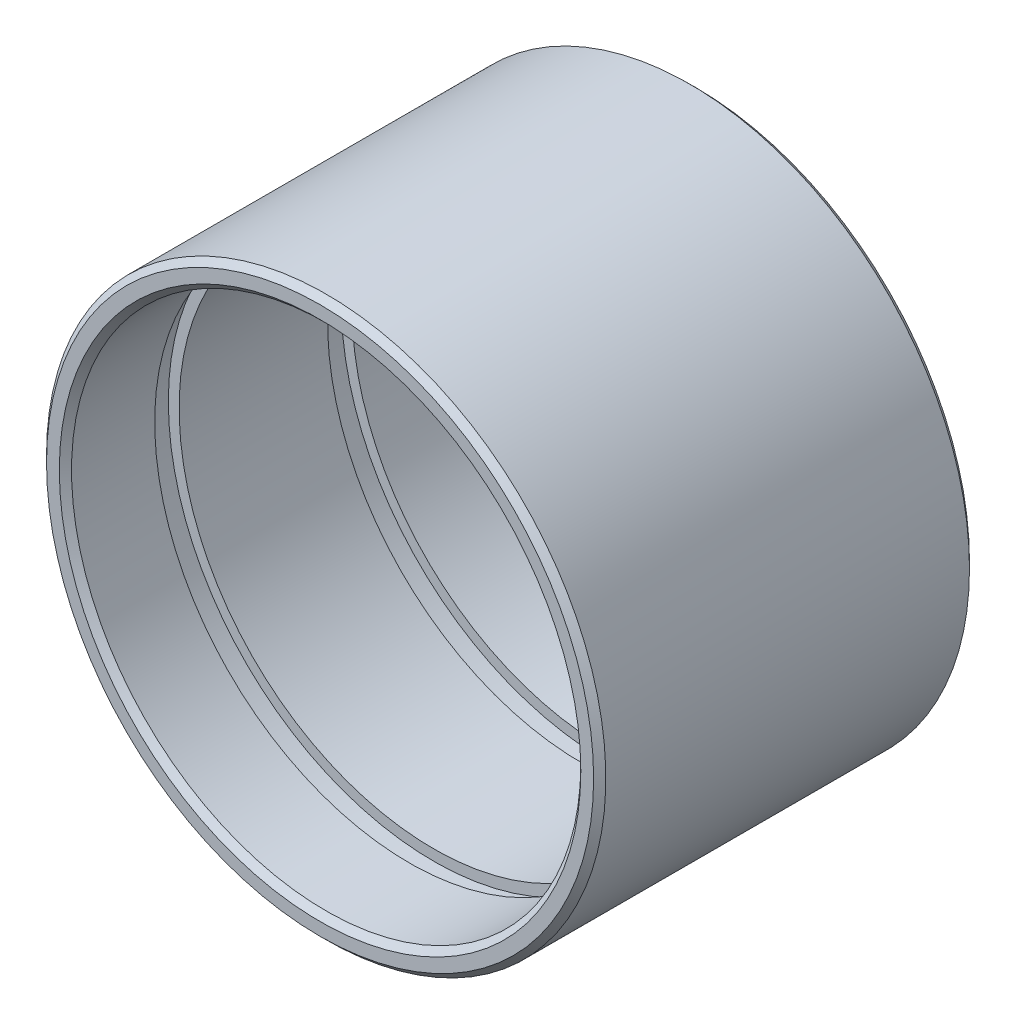
ISO-10303-21;
HEADER;
FILE_DESCRIPTION(('STEP AP214'),'2;1');
FILE_NAME('part.step','',(''),(''),'','','');
FILE_SCHEMA(('AUTOMOTIVE_DESIGN { 1 0 10303 214 1 1 1 1 }'));
ENDSEC;
DATA;
#1=APPLICATION_CONTEXT('core data for automotive mechanical design processes');
#2=APPLICATION_PROTOCOL_DEFINITION('international standard','automotive_design',2000,#1);
#3=PRODUCT_CONTEXT('',#1,'mechanical');
#4=PRODUCT('Part','Part','',(#3));
#5=PRODUCT_RELATED_PRODUCT_CATEGORY('part','',(#4));
#6=PRODUCT_DEFINITION_FORMATION('','',#4);
#7=PRODUCT_DEFINITION_CONTEXT('part definition',#1,'design');
#8=PRODUCT_DEFINITION('design','',#6,#7);
#9=PRODUCT_DEFINITION_SHAPE('','',#8);
#10=(LENGTH_UNIT() NAMED_UNIT(*) SI_UNIT(.MILLI.,.METRE.));
#11=(NAMED_UNIT(*) PLANE_ANGLE_UNIT() SI_UNIT($,.RADIAN.));
#12=(NAMED_UNIT(*) SI_UNIT($,.STERADIAN.) SOLID_ANGLE_UNIT());
#13=UNCERTAINTY_MEASURE_WITH_UNIT(LENGTH_MEASURE(1.E-05),#10,'distance_accuracy_value','');
#14=(GEOMETRIC_REPRESENTATION_CONTEXT(3) GLOBAL_UNCERTAINTY_ASSIGNED_CONTEXT((#13)) GLOBAL_UNIT_ASSIGNED_CONTEXT((#10,
#11,#12)) REPRESENTATION_CONTEXT('',''));
#15=CARTESIAN_POINT('',(0.,0.,0.));
#16=DIRECTION('',(0.,0.,1.));
#17=DIRECTION('',(1.,0.,0.));
#18=AXIS2_PLACEMENT_3D('',#15,#16,#17);
#19=CARTESIAN_POINT('',(0.,0.,23.4696));
#20=DIRECTION('',(0.,0.,-1.));
#21=DIRECTION('',(-1.,0.,0.));
#22=AXIS2_PLACEMENT_3D('',#19,#20,#21);
#23=CYLINDRICAL_SURFACE('',#22,15.9004);
#24=CARTESIAN_POINT('',(0.,0.,7.0993));
#25=DIRECTION('',(0.,0.,1.));
#26=DIRECTION('',(1.,0.,0.));
#27=AXIS2_PLACEMENT_3D('',#24,#25,#26);
#28=CIRCLE('',#27,15.9004);
#29=CARTESIAN_POINT('',(15.9004,0.,7.0993));
#30=VERTEX_POINT('',#29);
#31=EDGE_CURVE('E73',#30,#30,#28,.T.);
#32=ORIENTED_EDGE('',*,*,#31,.F.);
#33=EDGE_LOOP('',(#32));
#34=FACE_BOUND('',#33,.T.);
#35=CARTESIAN_POINT('',(0.,0.,16.3703));
#36=DIRECTION('',(0.,0.,1.));
#37=DIRECTION('',(1.,0.,0.));
#38=AXIS2_PLACEMENT_3D('',#35,#36,#37);
#39=CIRCLE('',#38,15.9004);
#40=CARTESIAN_POINT('',(15.9004,0.,16.3703));
#41=VERTEX_POINT('',#40);
#42=EDGE_CURVE('E67',#41,#41,#39,.T.);
#43=ORIENTED_EDGE('',*,*,#42,.T.);
#44=EDGE_LOOP('',(#43));
#45=FACE_BOUND('',#44,.T.);
#46=ADVANCED_FACE('F30',(#34,#45),#23,.F.);
#47=CARTESIAN_POINT('',(0.,0.,0.381000000000006));
#48=DIRECTION('',(0.,0.,1.));
#49=DIRECTION('',(1.,0.,0.));
#50=AXIS2_PLACEMENT_3D('',#47,#48,#49);
#51=CIRCLE('',#50,15.9004);
#52=CARTESIAN_POINT('',(-15.9004,0.,0.381000000000006));
#53=VERTEX_POINT('',#52);
#54=EDGE_CURVE('E10',#53,#53,#51,.F.);
#55=ORIENTED_EDGE('',*,*,#54,.T.);
#56=EDGE_LOOP('',(#55));
#57=FACE_BOUND('',#56,.T.);
#58=CARTESIAN_POINT('',(0.,0.,5.5753));
#59=DIRECTION('',(0.,0.,1.));
#60=DIRECTION('',(1.,0.,0.));
#61=AXIS2_PLACEMENT_3D('',#58,#59,#60);
#62=CIRCLE('',#61,15.9004);
#63=CARTESIAN_POINT('',(15.9004,0.,5.5753));
#64=VERTEX_POINT('',#63);
#65=EDGE_CURVE('E62',#64,#64,#62,.T.);
#66=ORIENTED_EDGE('',*,*,#65,.T.);
#67=EDGE_LOOP('',(#66));
#68=FACE_BOUND('',#67,.T.);
#69=ADVANCED_FACE('F105',(#57,#68),#23,.F.);
#70=CARTESIAN_POINT('',(0.,0.,23.4696));
#71=DIRECTION('',(0.,0.,1.));
#72=DIRECTION('',(1.,0.,0.));
#73=AXIS2_PLACEMENT_3D('',#70,#71,#72);
#74=PLANE('',#73);
#75=CARTESIAN_POINT('',(0.,0.,23.4696));
#76=DIRECTION('',(0.,0.,1.));
#77=DIRECTION('',(1.,0.,0.));
#78=AXIS2_PLACEMENT_3D('',#75,#76,#77);
#79=CIRCLE('',#78,16.2814);
#80=CARTESIAN_POINT('',(16.2814,0.,23.4696));
#81=VERTEX_POINT('',#80);
#82=EDGE_CURVE('E53',#81,#81,#79,.F.);
#83=ORIENTED_EDGE('',*,*,#82,.T.);
#84=EDGE_LOOP('',(#83));
#85=FACE_BOUND('',#84,.T.);
#86=CARTESIAN_POINT('',(0.,0.,23.4696));
#87=DIRECTION('',(0.,0.,1.));
#88=DIRECTION('',(1.,0.,0.));
#89=AXIS2_PLACEMENT_3D('',#86,#87,#88);
#90=CIRCLE('',#89,17.0815);
#91=CARTESIAN_POINT('',(-17.0815,0.,23.4696));
#92=VERTEX_POINT('',#91);
#93=EDGE_CURVE('E56',#92,#92,#90,.T.);
#94=ORIENTED_EDGE('',*,*,#93,.T.);
#95=EDGE_LOOP('',(#94));
#96=FACE_BOUND('',#95,.T.);
#97=ADVANCED_FACE('F112',(#85,#96),#74,.T.);
#98=CARTESIAN_POINT('',(0.,0.,0.));
#99=DIRECTION('',(0.,0.,1.));
#100=DIRECTION('',(1.,0.,0.));
#101=AXIS2_PLACEMENT_3D('',#98,#99,#100);
#102=PLANE('',#101);
#103=CARTESIAN_POINT('',(0.,0.,0.));
#104=DIRECTION('',(0.,0.,1.));
#105=DIRECTION('',(1.,0.,0.));
#106=AXIS2_PLACEMENT_3D('',#103,#104,#105);
#107=CIRCLE('',#106,16.2814);
#108=CARTESIAN_POINT('',(-16.2814,0.,0.));
#109=VERTEX_POINT('',#108);
#110=EDGE_CURVE('E37',#109,#109,#107,.T.);
#111=ORIENTED_EDGE('',*,*,#110,.T.);
#112=EDGE_LOOP('',(#111));
#113=FACE_BOUND('',#112,.T.);
#114=CARTESIAN_POINT('',(0.,0.,0.));
#115=DIRECTION('',(0.,0.,1.));
#116=DIRECTION('',(1.,0.,0.));
#117=AXIS2_PLACEMENT_3D('',#114,#115,#116);
#118=CIRCLE('',#117,17.0815);
#119=CARTESIAN_POINT('',(17.0815,0.,0.));
#120=VERTEX_POINT('',#119);
#121=EDGE_CURVE('E41',#120,#120,#118,.F.);
#122=ORIENTED_EDGE('',*,*,#121,.T.);
#123=EDGE_LOOP('',(#122));
#124=FACE_BOUND('',#123,.T.);
#125=ADVANCED_FACE('F127',(#113,#124),#102,.F.);
#126=CARTESIAN_POINT('',(0.,0.,23.4696));
#127=DIRECTION('',(0.,0.,-1.));
#128=DIRECTION('',(-1.,0.,0.));
#129=AXIS2_PLACEMENT_3D('',#126,#127,#128);
#130=CYLINDRICAL_SURFACE('',#129,17.4625);
#131=CARTESIAN_POINT('',(0.,0.,23.0886));
#132=DIRECTION('',(0.,0.,1.));
#133=DIRECTION('',(1.,0.,0.));
#134=AXIS2_PLACEMENT_3D('',#131,#132,#133);
#135=CIRCLE('',#134,17.4625);
#136=CARTESIAN_POINT('',(-17.4625,0.,23.0886));
#137=VERTEX_POINT('',#136);
#138=EDGE_CURVE('E45',#137,#137,#135,.F.);
#139=CARTESIAN_POINT('',(0.,0.,0.381000000000006));
#140=DIRECTION('',(0.,0.,1.));
#141=DIRECTION('',(1.,0.,0.));
#142=AXIS2_PLACEMENT_3D('',#139,#140,#141);
#143=CIRCLE('',#142,17.4625);
#144=CARTESIAN_POINT('',(-17.4625,0.,0.381000000000006));
#145=VERTEX_POINT('',#144);
#146=EDGE_CURVE('E50',#145,#145,#143,.T.);
#147=CARTESIAN_POINT('',(-17.4625,0.,23.0886));
#148=CARTESIAN_POINT('',(-17.4625,0.,22.8520625));
#149=CARTESIAN_POINT('',(-17.4625,0.,22.615525));
#150=CARTESIAN_POINT('',(-17.4625,0.,22.14245));
#151=CARTESIAN_POINT('',(-17.4625,0.,21.9059125));
#152=CARTESIAN_POINT('',(-17.4625,0.,21.4328375));
#153=CARTESIAN_POINT('',(-17.4625,0.,21.1963));
#154=CARTESIAN_POINT('',(-17.4625,0.,20.723225));
#155=CARTESIAN_POINT('',(-17.4625,0.,20.4866875));
#156=CARTESIAN_POINT('',(-17.4625,0.,20.0136125));
#157=CARTESIAN_POINT('',(-17.4625,0.,19.777075));
#158=CARTESIAN_POINT('',(-17.4625,0.,19.304));
#159=CARTESIAN_POINT('',(-17.4625,0.,19.0674625));
#160=CARTESIAN_POINT('',(-17.4625,0.,18.5943875));
#161=CARTESIAN_POINT('',(-17.4625,0.,18.35785));
#162=CARTESIAN_POINT('',(-17.4625,0.,17.884775));
#163=CARTESIAN_POINT('',(-17.4625,0.,17.6482375));
#164=CARTESIAN_POINT('',(-17.4625,0.,17.1751625));
#165=CARTESIAN_POINT('',(-17.4625,0.,16.938625));
#166=CARTESIAN_POINT('',(-17.4625,0.,16.46555));
#167=CARTESIAN_POINT('',(-17.4625,0.,16.2290125));
#168=CARTESIAN_POINT('',(-17.4625,0.,15.7559375));
#169=CARTESIAN_POINT('',(-17.4625,0.,15.5194));
#170=CARTESIAN_POINT('',(-17.4625,0.,15.046325));
#171=CARTESIAN_POINT('',(-17.4625,0.,14.8097875));
#172=CARTESIAN_POINT('',(-17.4625,0.,14.3367125));
#173=CARTESIAN_POINT('',(-17.4625,0.,14.100175));
#174=CARTESIAN_POINT('',(-17.4625,0.,13.6271));
#175=CARTESIAN_POINT('',(-17.4625,0.,13.3905625));
#176=CARTESIAN_POINT('',(-17.4625,0.,12.9174875));
#177=CARTESIAN_POINT('',(-17.4625,0.,12.68095));
#178=CARTESIAN_POINT('',(-17.4625,0.,12.207875));
#179=CARTESIAN_POINT('',(-17.4625,0.,11.9713375));
#180=CARTESIAN_POINT('',(-17.4625,0.,11.4982625));
#181=CARTESIAN_POINT('',(-17.4625,0.,11.261725));
#182=CARTESIAN_POINT('',(-17.4625,0.,10.78865));
#183=CARTESIAN_POINT('',(-17.4625,0.,10.5521125));
#184=CARTESIAN_POINT('',(-17.4625,0.,10.0790375));
#185=CARTESIAN_POINT('',(-17.4625,0.,9.8425));
#186=CARTESIAN_POINT('',(-17.4625,0.,9.369425));
#187=CARTESIAN_POINT('',(-17.4625,0.,9.1328875));
#188=CARTESIAN_POINT('',(-17.4625,0.,8.6598125));
#189=CARTESIAN_POINT('',(-17.4625,0.,8.423275));
#190=CARTESIAN_POINT('',(-17.4625,0.,7.9502));
#191=CARTESIAN_POINT('',(-17.4625,0.,7.7136625));
#192=CARTESIAN_POINT('',(-17.4625,0.,7.2405875));
#193=CARTESIAN_POINT('',(-17.4625,0.,7.00405));
#194=CARTESIAN_POINT('',(-17.4625,0.,6.530975));
#195=CARTESIAN_POINT('',(-17.4625,0.,6.2944375));
#196=CARTESIAN_POINT('',(-17.4625,0.,5.8213625));
#197=CARTESIAN_POINT('',(-17.4625,0.,5.584825));
#198=CARTESIAN_POINT('',(-17.4625,0.,5.11175));
#199=CARTESIAN_POINT('',(-17.4625,0.,4.8752125));
#200=CARTESIAN_POINT('',(-17.4625,0.,4.4021375));
#201=CARTESIAN_POINT('',(-17.4625,0.,4.1656));
#202=CARTESIAN_POINT('',(-17.4625,0.,3.692525));
#203=CARTESIAN_POINT('',(-17.4625,0.,3.45598750000001));
#204=CARTESIAN_POINT('',(-17.4625,0.,2.9829125));
#205=CARTESIAN_POINT('',(-17.4625,0.,2.746375));
#206=CARTESIAN_POINT('',(-17.4625,0.,2.2733));
#207=CARTESIAN_POINT('',(-17.4625,0.,2.0367625));
#208=CARTESIAN_POINT('',(-17.4625,0.,1.5636875));
#209=CARTESIAN_POINT('',(-17.4625,0.,1.32715));
#210=CARTESIAN_POINT('',(-17.4625,0.,0.854075000000005));
#211=CARTESIAN_POINT('',(-17.4625,0.,0.617537500000005));
#212=CARTESIAN_POINT('',(-17.4625,0.,0.381000000000006));
#213=B_SPLINE_CURVE_WITH_KNOTS('',3,(#147,#148,#149,#150,#151,#152,#153,#154,#155,#156,#157,
#158,#159,#160,#161,#162,#163,#164,#165,#166,#167,#168,#169,#170,#171,#172,#173,#174,#175,#176,
#177,#178,#179,#180,#181,#182,#183,#184,#185,#186,#187,#188,#189,#190,#191,#192,#193,#194,#195,
#196,#197,#198,#199,#200,#201,#202,#203,#204,#205,#206,#207,#208,#209,#210,#211,#212),
.UNSPECIFIED.,.F.,.F.,(4,2,2,2,2,2,2,2,2,2,2,2,2,2,2,2,2,2,2,2,2,2,2,2,2,2,2,2,2,2,2,2,4),(0.,
0.709612500000002,1.419225,2.1288375,2.83845,3.5480625,4.257675,4.9672875,5.6769,6.3865125,
7.096125,7.8057375,8.51535,9.2249625,9.934575,10.6441875,11.3538,12.0634125,12.773025,
13.4826375,14.19225,14.9018625,15.611475,16.3210875,17.0307,17.7403125,18.449925,19.1595375,
19.86915,20.5787625,21.288375,21.9979875,22.7076),.UNSPECIFIED.);
#214=EDGE_CURVE('BSEAM119',#137,#145,#213,.T.);
#215=ORIENTED_EDGE('',*,*,#138,.T.);
#216=ORIENTED_EDGE('',*,*,#146,.T.);
#217=ORIENTED_EDGE('',*,*,#214,.T.);
#218=ORIENTED_EDGE('',*,*,#214,.F.);
#219=EDGE_LOOP('',(#215,#217,#216,#218));
#220=FACE_BOUND('',#219,.T.);
#221=ADVANCED_FACE('F119',(#220),#130,.T.);
#222=CARTESIAN_POINT('',(0.,0.,23.0886));
#223=DIRECTION('',(0.,0.,1.));
#224=DIRECTION('',(1.,0.,0.));
#225=AXIS2_PLACEMENT_3D('',#222,#223,#224);
#226=CIRCLE('',#225,15.9004);
#227=CARTESIAN_POINT('',(15.9004,0.,23.0886));
#228=VERTEX_POINT('',#227);
#229=EDGE_CURVE('E59',#228,#228,#226,.T.);
#230=ORIENTED_EDGE('',*,*,#229,.T.);
#231=EDGE_LOOP('',(#230));
#232=FACE_BOUND('',#231,.T.);
#233=CARTESIAN_POINT('',(0.,0.,17.8943));
#234=DIRECTION('',(0.,0.,1.));
#235=DIRECTION('',(1.,0.,0.));
#236=AXIS2_PLACEMENT_3D('',#233,#234,#235);
#237=CIRCLE('',#236,15.9004);
#238=CARTESIAN_POINT('',(15.9004,0.,17.8943));
#239=VERTEX_POINT('',#238);
#240=EDGE_CURVE('E63',#239,#239,#237,.T.);
#241=ORIENTED_EDGE('',*,*,#240,.F.);
#242=EDGE_LOOP('',(#241));
#243=FACE_BOUND('',#242,.T.);
#244=ADVANCED_FACE('F108',(#232,#243),#23,.F.);
#245=CARTESIAN_POINT('',(0.,0.,5.5753));
#246=DIRECTION('',(0.,0.,1.));
#247=DIRECTION('',(1.,0.,0.));
#248=AXIS2_PLACEMENT_3D('',#245,#246,#247);
#249=CYLINDRICAL_SURFACE('',#248,16.5735);
#250=CARTESIAN_POINT('',(0.,0.,5.5753));
#251=DIRECTION('',(0.,0.,1.));
#252=DIRECTION('',(1.,0.,0.));
#253=AXIS2_PLACEMENT_3D('',#250,#251,#252);
#254=CIRCLE('',#253,16.5735);
#255=CARTESIAN_POINT('',(16.5735,0.,5.5753));
#256=VERTEX_POINT('',#255);
#257=EDGE_CURVE('E76',#256,#256,#254,.T.);
#258=CARTESIAN_POINT('',(0.,0.,7.0993));
#259=DIRECTION('',(0.,0.,1.));
#260=DIRECTION('',(1.,0.,0.));
#261=AXIS2_PLACEMENT_3D('',#258,#259,#260);
#262=CIRCLE('',#261,16.5735);
#263=CARTESIAN_POINT('',(16.5735,0.,7.0993));
#264=VERTEX_POINT('',#263);
#265=EDGE_CURVE('E66',#264,#264,#262,.T.);
#266=CARTESIAN_POINT('',(16.5735,0.,5.5753));
#267=CARTESIAN_POINT('',(16.5735,0.,5.591175));
#268=CARTESIAN_POINT('',(16.5735,0.,5.60705));
#269=CARTESIAN_POINT('',(16.5735,0.,5.6388));
#270=CARTESIAN_POINT('',(16.5735,0.,5.654675));
#271=CARTESIAN_POINT('',(16.5735,0.,5.686425));
#272=CARTESIAN_POINT('',(16.5735,0.,5.7023));
#273=CARTESIAN_POINT('',(16.5735,0.,5.73405));
#274=CARTESIAN_POINT('',(16.5735,0.,5.749925));
#275=CARTESIAN_POINT('',(16.5735,0.,5.781675));
#276=CARTESIAN_POINT('',(16.5735,0.,5.79755));
#277=CARTESIAN_POINT('',(16.5735,0.,5.8293));
#278=CARTESIAN_POINT('',(16.5735,0.,5.845175));
#279=CARTESIAN_POINT('',(16.5735,0.,5.876925));
#280=CARTESIAN_POINT('',(16.5735,0.,5.8928));
#281=CARTESIAN_POINT('',(16.5735,0.,5.92455));
#282=CARTESIAN_POINT('',(16.5735,0.,5.940425));
#283=CARTESIAN_POINT('',(16.5735,0.,5.972175));
#284=CARTESIAN_POINT('',(16.5735,0.,5.98805));
#285=CARTESIAN_POINT('',(16.5735,0.,6.0198));
#286=CARTESIAN_POINT('',(16.5735,0.,6.035675));
#287=CARTESIAN_POINT('',(16.5735,0.,6.067425));
#288=CARTESIAN_POINT('',(16.5735,0.,6.0833));
#289=CARTESIAN_POINT('',(16.5735,0.,6.11505));
#290=CARTESIAN_POINT('',(16.5735,0.,6.130925));
#291=CARTESIAN_POINT('',(16.5735,0.,6.162675));
#292=CARTESIAN_POINT('',(16.5735,0.,6.17855));
#293=CARTESIAN_POINT('',(16.5735,0.,6.2103));
#294=CARTESIAN_POINT('',(16.5735,0.,6.226175));
#295=CARTESIAN_POINT('',(16.5735,0.,6.257925));
#296=CARTESIAN_POINT('',(16.5735,0.,6.2738));
#297=CARTESIAN_POINT('',(16.5735,0.,6.30555));
#298=CARTESIAN_POINT('',(16.5735,0.,6.321425));
#299=CARTESIAN_POINT('',(16.5735,0.,6.353175));
#300=CARTESIAN_POINT('',(16.5735,0.,6.36905));
#301=CARTESIAN_POINT('',(16.5735,0.,6.4008));
#302=CARTESIAN_POINT('',(16.5735,0.,6.416675));
#303=CARTESIAN_POINT('',(16.5735,0.,6.448425));
#304=CARTESIAN_POINT('',(16.5735,0.,6.4643));
#305=CARTESIAN_POINT('',(16.5735,0.,6.49605));
#306=CARTESIAN_POINT('',(16.5735,0.,6.511925));
#307=CARTESIAN_POINT('',(16.5735,0.,6.543675));
#308=CARTESIAN_POINT('',(16.5735,0.,6.55955));
#309=CARTESIAN_POINT('',(16.5735,0.,6.5913));
#310=CARTESIAN_POINT('',(16.5735,0.,6.607175));
#311=CARTESIAN_POINT('',(16.5735,0.,6.638925));
#312=CARTESIAN_POINT('',(16.5735,0.,6.6548));
#313=CARTESIAN_POINT('',(16.5735,0.,6.68655));
#314=CARTESIAN_POINT('',(16.5735,0.,6.702425));
#315=CARTESIAN_POINT('',(16.5735,0.,6.734175));
#316=CARTESIAN_POINT('',(16.5735,0.,6.75005));
#317=CARTESIAN_POINT('',(16.5735,0.,6.7818));
#318=CARTESIAN_POINT('',(16.5735,0.,6.797675));
#319=CARTESIAN_POINT('',(16.5735,0.,6.829425));
#320=CARTESIAN_POINT('',(16.5735,0.,6.8453));
#321=CARTESIAN_POINT('',(16.5735,0.,6.87705));
#322=CARTESIAN_POINT('',(16.5735,0.,6.892925));
#323=CARTESIAN_POINT('',(16.5735,0.,6.924675));
#324=CARTESIAN_POINT('',(16.5735,0.,6.94055));
#325=CARTESIAN_POINT('',(16.5735,0.,6.9723));
#326=CARTESIAN_POINT('',(16.5735,0.,6.988175));
#327=CARTESIAN_POINT('',(16.5735,0.,7.019925));
#328=CARTESIAN_POINT('',(16.5735,0.,7.0358));
#329=CARTESIAN_POINT('',(16.5735,0.,7.06755));
#330=CARTESIAN_POINT('',(16.5735,0.,7.083425));
#331=CARTESIAN_POINT('',(16.5735,0.,7.0993));
#332=B_SPLINE_CURVE_WITH_KNOTS('',3,(#266,#267,#268,#269,#270,#271,#272,#273,#274,#275,#276,
#277,#278,#279,#280,#281,#282,#283,#284,#285,#286,#287,#288,#289,#290,#291,#292,#293,#294,#295,
#296,#297,#298,#299,#300,#301,#302,#303,#304,#305,#306,#307,#308,#309,#310,#311,#312,#313,#314,
#315,#316,#317,#318,#319,#320,#321,#322,#323,#324,#325,#326,#327,#328,#329,#330,#331),
.UNSPECIFIED.,.F.,.F.,(4,2,2,2,2,2,2,2,2,2,2,2,2,2,2,2,2,2,2,2,2,2,2,2,2,2,2,2,2,2,2,2,4),(0.,
0.0476249999999999,0.0952499999999998,0.142875,0.1905,0.238125,0.28575,0.333374999999999,
0.380999999999999,0.428624999999999,0.47625,0.523875,0.5715,0.619125,0.66675,0.714375,0.762,
0.809625,0.85725,0.904874999999999,0.9525,1.000125,1.04775,1.095375,1.143,1.190625,1.23825,
1.285875,1.3335,1.381125,1.42875,1.476375,1.524),.UNSPECIFIED.);
#333=EDGE_CURVE('BSEAM118',#256,#264,#332,.T.);
#334=ORIENTED_EDGE('',*,*,#257,.F.);
#335=ORIENTED_EDGE('',*,*,#265,.T.);
#336=ORIENTED_EDGE('',*,*,#333,.T.);
#337=ORIENTED_EDGE('',*,*,#333,.F.);
#338=EDGE_LOOP('',(#334,#336,#335,#337));
#339=FACE_BOUND('',#338,.T.);
#340=ADVANCED_FACE('F118',(#339),#249,.F.);
#341=CARTESIAN_POINT('',(0.,0.,5.5753));
#342=DIRECTION('',(0.,0.,1.));
#343=DIRECTION('',(1.,0.,0.));
#344=AXIS2_PLACEMENT_3D('',#341,#342,#343);
#345=PLANE('',#344);
#346=ORIENTED_EDGE('',*,*,#65,.F.);
#347=EDGE_LOOP('',(#346));
#348=FACE_BOUND('',#347,.T.);
#349=ORIENTED_EDGE('',*,*,#257,.T.);
#350=EDGE_LOOP('',(#349));
#351=FACE_BOUND('',#350,.T.);
#352=ADVANCED_FACE('F125',(#348,#351),#345,.T.);
#353=CARTESIAN_POINT('',(0.,0.,7.0993));
#354=DIRECTION('',(0.,0.,1.));
#355=DIRECTION('',(1.,0.,0.));
#356=AXIS2_PLACEMENT_3D('',#353,#354,#355);
#357=PLANE('',#356);
#358=ORIENTED_EDGE('',*,*,#31,.T.);
#359=EDGE_LOOP('',(#358));
#360=FACE_BOUND('',#359,.T.);
#361=ORIENTED_EDGE('',*,*,#265,.F.);
#362=EDGE_LOOP('',(#361));
#363=FACE_BOUND('',#362,.T.);
#364=ADVANCED_FACE('F102',(#360,#363),#357,.F.);
#365=CARTESIAN_POINT('',(0.,0.,17.8943));
#366=DIRECTION('',(0.,0.,-1.));
#367=DIRECTION('',(-1.,0.,0.));
#368=AXIS2_PLACEMENT_3D('',#365,#366,#367);
#369=CYLINDRICAL_SURFACE('',#368,16.5735);
#370=CARTESIAN_POINT('',(0.,0.,17.8943));
#371=DIRECTION('',(0.,0.,1.));
#372=DIRECTION('',(1.,0.,0.));
#373=AXIS2_PLACEMENT_3D('',#370,#371,#372);
#374=CIRCLE('',#373,16.5735);
#375=CARTESIAN_POINT('',(-16.5735,0.,17.8943));
#376=VERTEX_POINT('',#375);
#377=EDGE_CURVE('E70',#376,#376,#374,.T.);
#378=CARTESIAN_POINT('',(0.,0.,16.3703));
#379=DIRECTION('',(0.,0.,1.));
#380=DIRECTION('',(1.,0.,0.));
#381=AXIS2_PLACEMENT_3D('',#378,#379,#380);
#382=CIRCLE('',#381,16.5735);
#383=CARTESIAN_POINT('',(-16.5735,0.,16.3703));
#384=VERTEX_POINT('',#383);
#385=EDGE_CURVE('E81',#384,#384,#382,.T.);
#386=CARTESIAN_POINT('',(-16.5735,0.,17.8943));
#387=CARTESIAN_POINT('',(-16.5735,0.,17.878425));
#388=CARTESIAN_POINT('',(-16.5735,0.,17.86255));
#389=CARTESIAN_POINT('',(-16.5735,0.,17.8308));
#390=CARTESIAN_POINT('',(-16.5735,0.,17.814925));
#391=CARTESIAN_POINT('',(-16.5735,0.,17.783175));
#392=CARTESIAN_POINT('',(-16.5735,0.,17.7673));
#393=CARTESIAN_POINT('',(-16.5735,0.,17.73555));
#394=CARTESIAN_POINT('',(-16.5735,0.,17.719675));
#395=CARTESIAN_POINT('',(-16.5735,0.,17.687925));
#396=CARTESIAN_POINT('',(-16.5735,0.,17.67205));
#397=CARTESIAN_POINT('',(-16.5735,0.,17.6403));
#398=CARTESIAN_POINT('',(-16.5735,0.,17.624425));
#399=CARTESIAN_POINT('',(-16.5735,0.,17.592675));
#400=CARTESIAN_POINT('',(-16.5735,0.,17.5768));
#401=CARTESIAN_POINT('',(-16.5735,0.,17.54505));
#402=CARTESIAN_POINT('',(-16.5735,0.,17.529175));
#403=CARTESIAN_POINT('',(-16.5735,0.,17.497425));
#404=CARTESIAN_POINT('',(-16.5735,0.,17.48155));
#405=CARTESIAN_POINT('',(-16.5735,0.,17.4498));
#406=CARTESIAN_POINT('',(-16.5735,0.,17.433925));
#407=CARTESIAN_POINT('',(-16.5735,0.,17.402175));
#408=CARTESIAN_POINT('',(-16.5735,0.,17.3863));
#409=CARTESIAN_POINT('',(-16.5735,0.,17.35455));
#410=CARTESIAN_POINT('',(-16.5735,0.,17.338675));
#411=CARTESIAN_POINT('',(-16.5735,0.,17.306925));
#412=CARTESIAN_POINT('',(-16.5735,0.,17.29105));
#413=CARTESIAN_POINT('',(-16.5735,0.,17.2593));
#414=CARTESIAN_POINT('',(-16.5735,0.,17.243425));
#415=CARTESIAN_POINT('',(-16.5735,0.,17.211675));
#416=CARTESIAN_POINT('',(-16.5735,0.,17.1958));
#417=CARTESIAN_POINT('',(-16.5735,0.,17.16405));
#418=CARTESIAN_POINT('',(-16.5735,0.,17.148175));
#419=CARTESIAN_POINT('',(-16.5735,0.,17.116425));
#420=CARTESIAN_POINT('',(-16.5735,0.,17.10055));
#421=CARTESIAN_POINT('',(-16.5735,0.,17.0688));
#422=CARTESIAN_POINT('',(-16.5735,0.,17.052925));
#423=CARTESIAN_POINT('',(-16.5735,0.,17.021175));
#424=CARTESIAN_POINT('',(-16.5735,0.,17.0053));
#425=CARTESIAN_POINT('',(-16.5735,0.,16.97355));
#426=CARTESIAN_POINT('',(-16.5735,0.,16.957675));
#427=CARTESIAN_POINT('',(-16.5735,0.,16.925925));
#428=CARTESIAN_POINT('',(-16.5735,0.,16.91005));
#429=CARTESIAN_POINT('',(-16.5735,0.,16.8783));
#430=CARTESIAN_POINT('',(-16.5735,0.,16.862425));
#431=CARTESIAN_POINT('',(-16.5735,0.,16.830675));
#432=CARTESIAN_POINT('',(-16.5735,0.,16.8148));
#433=CARTESIAN_POINT('',(-16.5735,0.,16.78305));
#434=CARTESIAN_POINT('',(-16.5735,0.,16.767175));
#435=CARTESIAN_POINT('',(-16.5735,0.,16.735425));
#436=CARTESIAN_POINT('',(-16.5735,0.,16.71955));
#437=CARTESIAN_POINT('',(-16.5735,0.,16.6878));
#438=CARTESIAN_POINT('',(-16.5735,0.,16.671925));
#439=CARTESIAN_POINT('',(-16.5735,0.,16.640175));
#440=CARTESIAN_POINT('',(-16.5735,0.,16.6243));
#441=CARTESIAN_POINT('',(-16.5735,0.,16.59255));
#442=CARTESIAN_POINT('',(-16.5735,0.,16.576675));
#443=CARTESIAN_POINT('',(-16.5735,0.,16.544925));
#444=CARTESIAN_POINT('',(-16.5735,0.,16.52905));
#445=CARTESIAN_POINT('',(-16.5735,0.,16.4973));
#446=CARTESIAN_POINT('',(-16.5735,0.,16.481425));
#447=CARTESIAN_POINT('',(-16.5735,0.,16.449675));
#448=CARTESIAN_POINT('',(-16.5735,0.,16.4338));
#449=CARTESIAN_POINT('',(-16.5735,0.,16.40205));
#450=CARTESIAN_POINT('',(-16.5735,0.,16.386175));
#451=CARTESIAN_POINT('',(-16.5735,0.,16.3703));
#452=B_SPLINE_CURVE_WITH_KNOTS('',3,(#386,#387,#388,#389,#390,#391,#392,#393,#394,#395,#396,
#397,#398,#399,#400,#401,#402,#403,#404,#405,#406,#407,#408,#409,#410,#411,#412,#413,#414,#415,
#416,#417,#418,#419,#420,#421,#422,#423,#424,#425,#426,#427,#428,#429,#430,#431,#432,#433,#434,
#435,#436,#437,#438,#439,#440,#441,#442,#443,#444,#445,#446,#447,#448,#449,#450,#451),
.UNSPECIFIED.,.F.,.F.,(4,2,2,2,2,2,2,2,2,2,2,2,2,2,2,2,2,2,2,2,2,2,2,2,2,2,2,2,2,2,2,2,4),(0.,
0.0476249999999991,0.0952499999999981,0.142874999999997,0.1905,0.238124999999999,
0.285749999999998,0.333374999999997,0.380999999999999,0.428624999999998,0.476249999999998,
0.523875,0.571499999999999,0.619124999999998,0.666749999999997,0.714375,0.761999999999999,
0.809624999999998,0.85725,0.904874999999999,0.952499999999998,1.000125,1.04775,1.095375,1.143,
1.190625,1.23825,1.285875,1.3335,1.381125,1.42875,1.476375,1.524),.UNSPECIFIED.);
#453=EDGE_CURVE('BSEAM87',#376,#384,#452,.T.);
#454=ORIENTED_EDGE('',*,*,#377,.T.);
#455=ORIENTED_EDGE('',*,*,#385,.F.);
#456=ORIENTED_EDGE('',*,*,#453,.T.);
#457=ORIENTED_EDGE('',*,*,#453,.F.);
#458=EDGE_LOOP('',(#454,#456,#455,#457));
#459=FACE_BOUND('',#458,.T.);
#460=ADVANCED_FACE('F87',(#459),#369,.F.);
#461=CARTESIAN_POINT('',(0.,0.,17.8943));
#462=DIRECTION('',(0.,0.,1.));
#463=DIRECTION('',(1.,0.,0.));
#464=AXIS2_PLACEMENT_3D('',#461,#462,#463);
#465=PLANE('',#464);
#466=ORIENTED_EDGE('',*,*,#240,.T.);
#467=EDGE_LOOP('',(#466));
#468=FACE_BOUND('',#467,.T.);
#469=ORIENTED_EDGE('',*,*,#377,.F.);
#470=EDGE_LOOP('',(#469));
#471=FACE_BOUND('',#470,.T.);
#472=ADVANCED_FACE('F90',(#468,#471),#465,.F.);
#473=CARTESIAN_POINT('',(0.,0.,16.3703));
#474=DIRECTION('',(0.,0.,1.));
#475=DIRECTION('',(1.,0.,0.));
#476=AXIS2_PLACEMENT_3D('',#473,#474,#475);
#477=PLANE('',#476);
#478=ORIENTED_EDGE('',*,*,#42,.F.);
#479=EDGE_LOOP('',(#478));
#480=FACE_BOUND('',#479,.T.);
#481=ORIENTED_EDGE('',*,*,#385,.T.);
#482=EDGE_LOOP('',(#481));
#483=FACE_BOUND('',#482,.T.);
#484=ADVANCED_FACE('F92',(#480,#483),#477,.T.);
#485=CARTESIAN_POINT('',(0.,0.,23.0886));
#486=DIRECTION('',(0.,0.,1.));
#487=DIRECTION('',(1.,0.,0.));
#488=AXIS2_PLACEMENT_3D('',#485,#486,#487);
#489=CONICAL_SURFACE('',#488,15.9004,0.785398163397444);
#490=CARTESIAN_POINT('',(16.2814,0.,23.4696));
#491=CARTESIAN_POINT('',(16.27743125,0.,23.46563125));
#492=CARTESIAN_POINT('',(16.2734625,0.,23.4616625));
#493=CARTESIAN_POINT('',(16.265525,0.,23.453725));
#494=CARTESIAN_POINT('',(16.26155625,0.,23.44975625));
#495=CARTESIAN_POINT('',(16.25361875,0.,23.44181875));
#496=CARTESIAN_POINT('',(16.24965,0.,23.43785));
#497=CARTESIAN_POINT('',(16.2417125,0.,23.4299125));
#498=CARTESIAN_POINT('',(16.23774375,0.,23.42594375));
#499=CARTESIAN_POINT('',(16.22980625,0.,23.41800625));
#500=CARTESIAN_POINT('',(16.2258375,0.,23.4140375));
#501=CARTESIAN_POINT('',(16.2179,0.,23.4061));
#502=CARTESIAN_POINT('',(16.21393125,0.,23.40213125));
#503=CARTESIAN_POINT('',(16.20599375,0.,23.39419375));
#504=CARTESIAN_POINT('',(16.202025,0.,23.390225));
#505=CARTESIAN_POINT('',(16.1940875,0.,23.3822875));
#506=CARTESIAN_POINT('',(16.19011875,0.,23.37831875));
#507=CARTESIAN_POINT('',(16.18218125,0.,23.37038125));
#508=CARTESIAN_POINT('',(16.1782125,0.,23.3664125));
#509=CARTESIAN_POINT('',(16.170275,0.,23.358475));
#510=CARTESIAN_POINT('',(16.16630625,0.,23.35450625));
#511=CARTESIAN_POINT('',(16.15836875,0.,23.34656875));
#512=CARTESIAN_POINT('',(16.1544,0.,23.3426));
#513=CARTESIAN_POINT('',(16.1464625,0.,23.3346625));
#514=CARTESIAN_POINT('',(16.14249375,0.,23.33069375));
#515=CARTESIAN_POINT('',(16.13455625,0.,23.32275625));
#516=CARTESIAN_POINT('',(16.1305875,0.,23.3187875));
#517=CARTESIAN_POINT('',(16.12265,0.,23.31085));
#518=CARTESIAN_POINT('',(16.11868125,0.,23.30688125));
#519=CARTESIAN_POINT('',(16.11074375,0.,23.29894375));
#520=CARTESIAN_POINT('',(16.106775,0.,23.294975));
#521=CARTESIAN_POINT('',(16.0988375,0.,23.2870375));
#522=CARTESIAN_POINT('',(16.09486875,0.,23.28306875));
#523=CARTESIAN_POINT('',(16.08693125,0.,23.27513125));
#524=CARTESIAN_POINT('',(16.0829625,0.,23.2711625));
#525=CARTESIAN_POINT('',(16.075025,0.,23.263225));
#526=CARTESIAN_POINT('',(16.07105625,0.,23.25925625));
#527=CARTESIAN_POINT('',(16.06311875,0.,23.25131875));
#528=CARTESIAN_POINT('',(16.05915,0.,23.24735));
#529=CARTESIAN_POINT('',(16.0512125,0.,23.2394125));
#530=CARTESIAN_POINT('',(16.04724375,0.,23.23544375));
#531=CARTESIAN_POINT('',(16.03930625,0.,23.22750625));
#532=CARTESIAN_POINT('',(16.0353375,0.,23.2235375));
#533=CARTESIAN_POINT('',(16.0274,0.,23.2156));
#534=CARTESIAN_POINT('',(16.02343125,0.,23.21163125));
#535=CARTESIAN_POINT('',(16.01549375,0.,23.20369375));
#536=CARTESIAN_POINT('',(16.011525,0.,23.199725));
#537=CARTESIAN_POINT('',(16.0035875,0.,23.1917875));
#538=CARTESIAN_POINT('',(15.99961875,0.,23.18781875));
#539=CARTESIAN_POINT('',(15.99168125,0.,23.17988125));
#540=CARTESIAN_POINT('',(15.9877125,0.,23.1759125));
#541=CARTESIAN_POINT('',(15.979775,0.,23.167975));
#542=CARTESIAN_POINT('',(15.97580625,0.,23.16400625));
#543=CARTESIAN_POINT('',(15.96786875,0.,23.15606875));
#544=CARTESIAN_POINT('',(15.9639,0.,23.1521));
#545=CARTESIAN_POINT('',(15.9559625,0.,23.1441625));
#546=CARTESIAN_POINT('',(15.95199375,0.,23.14019375));
#547=CARTESIAN_POINT('',(15.94405625,0.,23.13225625));
#548=CARTESIAN_POINT('',(15.9400875,0.,23.1282875));
#549=CARTESIAN_POINT('',(15.93215,0.,23.12035));
#550=CARTESIAN_POINT('',(15.92818125,0.,23.11638125));
#551=CARTESIAN_POINT('',(15.92024375,0.,23.10844375));
#552=CARTESIAN_POINT('',(15.916275,0.,23.104475));
#553=CARTESIAN_POINT('',(15.9083375,0.,23.0965375));
#554=CARTESIAN_POINT('',(15.90436875,0.,23.09256875));
#555=CARTESIAN_POINT('',(15.9004,0.,23.0886));
#556=B_SPLINE_CURVE_WITH_KNOTS('',3,(#490,#491,#492,#493,#494,#495,#496,#497,#498,#499,#500,
#501,#502,#503,#504,#505,#506,#507,#508,#509,#510,#511,#512,#513,#514,#515,#516,#517,#518,#519,
#520,#521,#522,#523,#524,#525,#526,#527,#528,#529,#530,#531,#532,#533,#534,#535,#536,#537,#538,
#539,#540,#541,#542,#543,#544,#545,#546,#547,#548,#549,#550,#551,#552,#553,#554,#555),
.UNSPECIFIED.,.F.,.F.,(4,2,2,2,2,2,2,2,2,2,2,2,2,2,2,2,2,2,2,2,2,2,2,2,2,2,2,2,2,2,2,2,4),(0.,
0.0168379802270056,0.0336759604540087,0.0505139406810167,0.0673519209080198,0.0841899011350229,
0.101027881362031,0.117865861589034,0.13470384181604,0.151541822043045,0.168379802270048,
0.185217782497054,0.202055762724059,0.218893742951062,0.235731723178068,0.252569703405074,
0.269407683632079,0.286245663859082,0.303083644086088,0.319921624313093,0.336759604540096,
0.353597584767102,0.370435564994107,0.387273545221111,0.404111525448119,0.420949505675122,
0.437787485902125,0.454625466129133,0.471463446356136,0.488301426583139,0.505139406810147,
0.52197738703715,0.538815367264153),.UNSPECIFIED.);
#557=EDGE_CURVE('BSEAM99',#81,#228,#556,.T.);
#558=ORIENTED_EDGE('',*,*,#82,.F.);
#559=ORIENTED_EDGE('',*,*,#229,.F.);
#560=ORIENTED_EDGE('',*,*,#557,.T.);
#561=ORIENTED_EDGE('',*,*,#557,.F.);
#562=EDGE_LOOP('',(#558,#560,#559,#561));
#563=FACE_BOUND('',#562,.T.);
#564=ADVANCED_FACE('F99',(#563),#489,.F.);
#565=CARTESIAN_POINT('',(0.,0.,23.4696));
#566=DIRECTION('',(0.,0.,-1.));
#567=DIRECTION('',(-1.,0.,0.));
#568=AXIS2_PLACEMENT_3D('',#565,#566,#567);
#569=CONICAL_SURFACE('',#568,17.0815,0.785398163397444);
#570=CARTESIAN_POINT('',(-17.4625,0.,23.0886));
#571=CARTESIAN_POINT('',(-17.45853125,0.,23.09256875));
#572=CARTESIAN_POINT('',(-17.4545625,0.,23.0965375));
#573=CARTESIAN_POINT('',(-17.446625,0.,23.104475));
#574=CARTESIAN_POINT('',(-17.44265625,0.,23.10844375));
#575=CARTESIAN_POINT('',(-17.43471875,0.,23.11638125));
#576=CARTESIAN_POINT('',(-17.43075,0.,23.12035));
#577=CARTESIAN_POINT('',(-17.4228125,0.,23.1282875));
#578=CARTESIAN_POINT('',(-17.41884375,0.,23.13225625));
#579=CARTESIAN_POINT('',(-17.41090625,0.,23.14019375));
#580=CARTESIAN_POINT('',(-17.4069375,0.,23.1441625));
#581=CARTESIAN_POINT('',(-17.399,0.,23.1521));
#582=CARTESIAN_POINT('',(-17.39503125,0.,23.15606875));
#583=CARTESIAN_POINT('',(-17.38709375,0.,23.16400625));
#584=CARTESIAN_POINT('',(-17.383125,0.,23.167975));
#585=CARTESIAN_POINT('',(-17.3751875,0.,23.1759125));
#586=CARTESIAN_POINT('',(-17.37121875,0.,23.17988125));
#587=CARTESIAN_POINT('',(-17.36328125,0.,23.18781875));
#588=CARTESIAN_POINT('',(-17.3593125,0.,23.1917875));
#589=CARTESIAN_POINT('',(-17.351375,0.,23.199725));
#590=CARTESIAN_POINT('',(-17.34740625,0.,23.20369375));
#591=CARTESIAN_POINT('',(-17.33946875,0.,23.21163125));
#592=CARTESIAN_POINT('',(-17.3355,0.,23.2156));
#593=CARTESIAN_POINT('',(-17.3275625,0.,23.2235375));
#594=CARTESIAN_POINT('',(-17.32359375,0.,23.22750625));
#595=CARTESIAN_POINT('',(-17.31565625,0.,23.23544375));
#596=CARTESIAN_POINT('',(-17.3116875,0.,23.2394125));
#597=CARTESIAN_POINT('',(-17.30375,0.,23.24735));
#598=CARTESIAN_POINT('',(-17.29978125,0.,23.25131875));
#599=CARTESIAN_POINT('',(-17.29184375,0.,23.25925625));
#600=CARTESIAN_POINT('',(-17.287875,0.,23.263225));
#601=CARTESIAN_POINT('',(-17.2799375,0.,23.2711625));
#602=CARTESIAN_POINT('',(-17.27596875,0.,23.27513125));
#603=CARTESIAN_POINT('',(-17.26803125,0.,23.28306875));
#604=CARTESIAN_POINT('',(-17.2640625,0.,23.2870375));
#605=CARTESIAN_POINT('',(-17.256125,0.,23.294975));
#606=CARTESIAN_POINT('',(-17.25215625,0.,23.29894375));
#607=CARTESIAN_POINT('',(-17.24421875,0.,23.30688125));
#608=CARTESIAN_POINT('',(-17.24025,0.,23.31085));
#609=CARTESIAN_POINT('',(-17.2323125,0.,23.3187875));
#610=CARTESIAN_POINT('',(-17.22834375,0.,23.32275625));
#611=CARTESIAN_POINT('',(-17.22040625,0.,23.33069375));
#612=CARTESIAN_POINT('',(-17.2164375,0.,23.3346625));
#613=CARTESIAN_POINT('',(-17.2085,0.,23.3426));
#614=CARTESIAN_POINT('',(-17.20453125,0.,23.34656875));
#615=CARTESIAN_POINT('',(-17.19659375,0.,23.35450625));
#616=CARTESIAN_POINT('',(-17.192625,0.,23.358475));
#617=CARTESIAN_POINT('',(-17.1846875,0.,23.3664125));
#618=CARTESIAN_POINT('',(-17.18071875,0.,23.37038125));
#619=CARTESIAN_POINT('',(-17.17278125,0.,23.37831875));
#620=CARTESIAN_POINT('',(-17.1688125,0.,23.3822875));
#621=CARTESIAN_POINT('',(-17.160875,0.,23.390225));
#622=CARTESIAN_POINT('',(-17.15690625,0.,23.39419375));
#623=CARTESIAN_POINT('',(-17.14896875,0.,23.40213125));
#624=CARTESIAN_POINT('',(-17.145,0.,23.4061));
#625=CARTESIAN_POINT('',(-17.1370625,0.,23.4140375));
#626=CARTESIAN_POINT('',(-17.13309375,0.,23.41800625));
#627=CARTESIAN_POINT('',(-17.12515625,0.,23.42594375));
#628=CARTESIAN_POINT('',(-17.1211875,0.,23.4299125));
#629=CARTESIAN_POINT('',(-17.11325,0.,23.43785));
#630=CARTESIAN_POINT('',(-17.10928125,0.,23.44181875));
#631=CARTESIAN_POINT('',(-17.10134375,0.,23.44975625));
#632=CARTESIAN_POINT('',(-17.097375,0.,23.453725));
#633=CARTESIAN_POINT('',(-17.0894375,0.,23.4616625));
#634=CARTESIAN_POINT('',(-17.08546875,0.,23.46563125));
#635=CARTESIAN_POINT('',(-17.0815,0.,23.4696));
#636=B_SPLINE_CURVE_WITH_KNOTS('',3,(#570,#571,#572,#573,#574,#575,#576,#577,#578,#579,#580,
#581,#582,#583,#584,#585,#586,#587,#588,#589,#590,#591,#592,#593,#594,#595,#596,#597,#598,#599,
#600,#601,#602,#603,#604,#605,#606,#607,#608,#609,#610,#611,#612,#613,#614,#615,#616,#617,#618,
#619,#620,#621,#622,#623,#624,#625,#626,#627,#628,#629,#630,#631,#632,#633,#634,#635),
.UNSPECIFIED.,.F.,.F.,(4,2,2,2,2,2,2,2,2,2,2,2,2,2,2,2,2,2,2,2,2,2,2,2,2,2,2,2,2,2,2,2,4),(0.,
0.016837980227008,0.0336759604540111,0.0505139406810167,0.0673519209080222,0.0841899011350253,
0.101027881362033,0.117865861589036,0.13470384181604,0.151541822043048,0.168379802270051,
0.185217782497056,0.202055762724062,0.218893742951065,0.23573172317807,0.252569703405076,
0.269407683632079,0.286245663859085,0.30308364408609,0.319921624313096,0.336759604540099,
0.353597584767104,0.37043556499411,0.387273545221113,0.404111525448121,0.420949505675124,
0.437787485902127,0.454625466129135,0.471463446356138,0.488301426583141,0.505139406810149,
0.521977387037152,0.53881536726416),.UNSPECIFIED.);
#637=EDGE_CURVE('BSEAM135',#137,#92,#636,.T.);
#638=ORIENTED_EDGE('',*,*,#138,.F.);
#639=ORIENTED_EDGE('',*,*,#93,.F.);
#640=ORIENTED_EDGE('',*,*,#637,.T.);
#641=ORIENTED_EDGE('',*,*,#637,.F.);
#642=EDGE_LOOP('',(#638,#640,#639,#641));
#643=FACE_BOUND('',#642,.T.);
#644=ADVANCED_FACE('F135',(#643),#569,.T.);
#645=CARTESIAN_POINT('',(0.,0.,0.));
#646=DIRECTION('',(0.,0.,-1.));
#647=DIRECTION('',(-1.,0.,0.));
#648=AXIS2_PLACEMENT_3D('',#645,#646,#647);
#649=CONICAL_SURFACE('',#648,16.2814,0.785398163397444);
#650=CARTESIAN_POINT('',(-15.9004,0.,0.381000000000006));
#651=CARTESIAN_POINT('',(-15.90436875,0.,0.377031250000005));
#652=CARTESIAN_POINT('',(-15.9083375,0.,0.373062500000006));
#653=CARTESIAN_POINT('',(-15.916275,0.,0.365125000000006));
#654=CARTESIAN_POINT('',(-15.92024375,0.,0.361156250000006));
#655=CARTESIAN_POINT('',(-15.92818125,0.,0.353218750000006));
#656=CARTESIAN_POINT('',(-15.93215,0.,0.349250000000006));
#657=CARTESIAN_POINT('',(-15.9400875,0.,0.341312500000005));
#658=CARTESIAN_POINT('',(-15.94405625,0.,0.337343750000005));
#659=CARTESIAN_POINT('',(-15.95199375,0.,0.329406250000005));
#660=CARTESIAN_POINT('',(-15.9559625,0.,0.325437500000006));
#661=CARTESIAN_POINT('',(-15.9639,0.,0.317500000000006));
#662=CARTESIAN_POINT('',(-15.96786875,0.,0.313531250000005));
#663=CARTESIAN_POINT('',(-15.97580625,0.,0.305593750000005));
#664=CARTESIAN_POINT('',(-15.979775,0.,0.301625000000005));
#665=CARTESIAN_POINT('',(-15.9877125,0.,0.293687500000005));
#666=CARTESIAN_POINT('',(-15.99168125,0.,0.289718750000005));
#667=CARTESIAN_POINT('',(-15.99961875,0.,0.281781250000005));
#668=CARTESIAN_POINT('',(-16.0035875,0.,0.277812500000005));
#669=CARTESIAN_POINT('',(-16.011525,0.,0.269875000000004));
#670=CARTESIAN_POINT('',(-16.01549375,0.,0.265906250000004));
#671=CARTESIAN_POINT('',(-16.02343125,0.,0.257968750000004));
#672=CARTESIAN_POINT('',(-16.0274,0.,0.254000000000004));
#673=CARTESIAN_POINT('',(-16.0353375,0.,0.246062500000004));
#674=CARTESIAN_POINT('',(-16.03930625,0.,0.242093750000004));
#675=CARTESIAN_POINT('',(-16.04724375,0.,0.234156250000004));
#676=CARTESIAN_POINT('',(-16.0512125,0.,0.230187500000003));
#677=CARTESIAN_POINT('',(-16.05915,0.,0.222250000000003));
#678=CARTESIAN_POINT('',(-16.06311875,0.,0.218281250000004));
#679=CARTESIAN_POINT('',(-16.07105625,0.,0.210343750000004));
#680=CARTESIAN_POINT('',(-16.075025,0.,0.206375000000004));
#681=CARTESIAN_POINT('',(-16.0829625,0.,0.198437500000003));
#682=CARTESIAN_POINT('',(-16.08693125,0.,0.194468750000003));
#683=CARTESIAN_POINT('',(-16.09486875,0.,0.186531250000003));
#684=CARTESIAN_POINT('',(-16.0988375,0.,0.182562500000003));
#685=CARTESIAN_POINT('',(-16.106775,0.,0.174625000000003));
#686=CARTESIAN_POINT('',(-16.11074375,0.,0.170656250000003));
#687=CARTESIAN_POINT('',(-16.11868125,0.,0.162718750000002));
#688=CARTESIAN_POINT('',(-16.12265,0.,0.158750000000003));
#689=CARTESIAN_POINT('',(-16.1305875,0.,0.150812500000003));
#690=CARTESIAN_POINT('',(-16.13455625,0.,0.146843750000003));
#691=CARTESIAN_POINT('',(-16.14249375,0.,0.138906250000002));
#692=CARTESIAN_POINT('',(-16.1464625,0.,0.134937500000002));
#693=CARTESIAN_POINT('',(-16.1544,0.,0.127000000000002));
#694=CARTESIAN_POINT('',(-16.15836875,0.,0.123031250000002));
#695=CARTESIAN_POINT('',(-16.16630625,0.,0.115093750000002));
#696=CARTESIAN_POINT('',(-16.170275,0.,0.111125000000002));
#697=CARTESIAN_POINT('',(-16.1782125,0.,0.103187500000002));
#698=CARTESIAN_POINT('',(-16.18218125,0.,0.0992187500000013));
#699=CARTESIAN_POINT('',(-16.19011875,0.,0.0912812500000013));
#700=CARTESIAN_POINT('',(-16.1940875,0.,0.0873125000000016));
#701=CARTESIAN_POINT('',(-16.202025,0.,0.0793750000000017));
#702=CARTESIAN_POINT('',(-16.20599375,0.,0.0754062500000014));
#703=CARTESIAN_POINT('',(-16.21393125,0.,0.0674687500000009));
#704=CARTESIAN_POINT('',(-16.2179,0.,0.0635000000000007));
#705=CARTESIAN_POINT('',(-16.2258375,0.,0.0555625000000007));
#706=CARTESIAN_POINT('',(-16.22980625,0.,0.051593750000001));
#707=CARTESIAN_POINT('',(-16.23774375,0.,0.0436562500000011));
#708=CARTESIAN_POINT('',(-16.2417125,0.,0.0396875000000008));
#709=CARTESIAN_POINT('',(-16.24965,0.,0.0317500000000003));
#710=CARTESIAN_POINT('',(-16.25361875,0.,0.0277812500000001));
#711=CARTESIAN_POINT('',(-16.26155625,0.,0.0198437500000001));
#712=CARTESIAN_POINT('',(-16.265525,0.,0.0158750000000003));
#713=CARTESIAN_POINT('',(-16.2734625,0.,0.00793750000000068));
#714=CARTESIAN_POINT('',(-16.27743125,0.,0.00396875000000088));
#715=CARTESIAN_POINT('',(-16.2814,0.,0.));
#716=B_SPLINE_CURVE_WITH_KNOTS('',3,(#650,#651,#652,#653,#654,#655,#656,#657,#658,#659,#660,
#661,#662,#663,#664,#665,#666,#667,#668,#669,#670,#671,#672,#673,#674,#675,#676,#677,#678,#679,
#680,#681,#682,#683,#684,#685,#686,#687,#688,#689,#690,#691,#692,#693,#694,#695,#696,#697,#698,
#699,#700,#701,#702,#703,#704,#705,#706,#707,#708,#709,#710,#711,#712,#713,#714,#715),
.UNSPECIFIED.,.F.,.F.,(4,2,2,2,2,2,2,2,2,2,2,2,2,2,2,2,2,2,2,2,2,2,2,2,2,2,2,2,2,2,2,2,4),(0.,
0.016837980227004,0.0336759604540105,0.0505139406810145,0.0673519209080185,0.084189901135025,
0.101027881362029,0.117865861589033,0.13470384181604,0.151541822043044,0.168379802270048,
0.185217782497054,0.202055762724058,0.218893742951062,0.235731723178069,0.252569703405073,
0.269407683632077,0.286245663859083,0.303083644086087,0.319921624313094,0.336759604540098,
0.353597584767102,0.370435564994108,0.387273545221112,0.404111525448116,0.420949505675123,
0.437787485902127,0.454625466129131,0.471463446356137,0.488301426583141,0.505139406810145,
0.521977387037152,0.538815367264156),.UNSPECIFIED.);
#717=EDGE_CURVE('BSEAM141',#53,#109,#716,.T.);
#718=ORIENTED_EDGE('',*,*,#54,.F.);
#719=ORIENTED_EDGE('',*,*,#110,.F.);
#720=ORIENTED_EDGE('',*,*,#717,.T.);
#721=ORIENTED_EDGE('',*,*,#717,.F.);
#722=EDGE_LOOP('',(#718,#720,#719,#721));
#723=FACE_BOUND('',#722,.T.);
#724=ADVANCED_FACE('F141',(#723),#649,.F.);
#725=CARTESIAN_POINT('',(0.,0.,0.381000000000006));
#726=DIRECTION('',(0.,0.,1.));
#727=DIRECTION('',(1.,0.,0.));
#728=AXIS2_PLACEMENT_3D('',#725,#726,#727);
#729=CONICAL_SURFACE('',#728,17.4625,0.785398163397444);
#730=ORIENTED_EDGE('',*,*,#121,.F.);
#731=EDGE_LOOP('',(#730));
#732=FACE_BOUND('',#731,.T.);
#733=ORIENTED_EDGE('',*,*,#146,.F.);
#734=EDGE_LOOP('',(#733));
#735=FACE_BOUND('',#734,.T.);
#736=ADVANCED_FACE('F32',(#732,#735),#729,.T.);
#737=CLOSED_SHELL('',(#46,#69,#97,#125,#221,#244,#340,#352,#364,#460,#472,#484,#564,#644,#724,#736));
#738=MANIFOLD_SOLID_BREP('B2',#737);
#739=ADVANCED_BREP_SHAPE_REPRESENTATION('',(#18,#738),#14);
#740=SHAPE_DEFINITION_REPRESENTATION(#9,#739);
ENDSEC;
END-ISO-10303-21;
